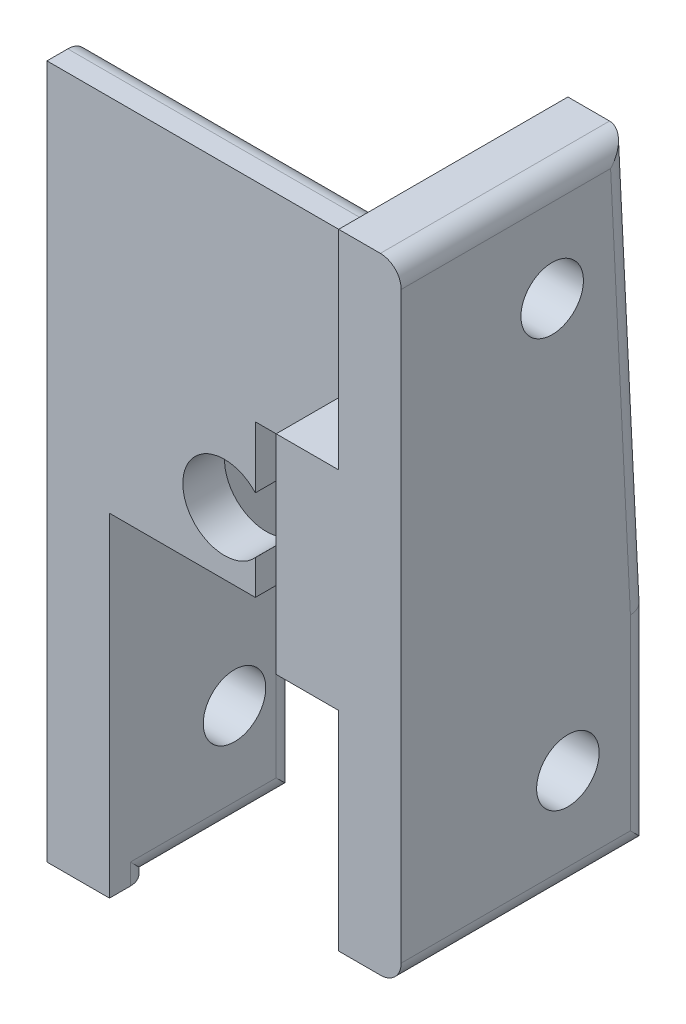
ISO-10303-21;
HEADER;
FILE_DESCRIPTION(('STEP AP214'),'2;1');
FILE_NAME('part.step','',(''),(''),'','','');
FILE_SCHEMA(('AUTOMOTIVE_DESIGN { 1 0 10303 214 1 1 1 1 }'));
ENDSEC;
DATA;
#1=APPLICATION_CONTEXT('core data for automotive mechanical design processes');
#2=APPLICATION_PROTOCOL_DEFINITION('international standard','automotive_design',2000,#1);
#3=PRODUCT_CONTEXT('',#1,'mechanical');
#4=PRODUCT('Part','Part','',(#3));
#5=PRODUCT_RELATED_PRODUCT_CATEGORY('part','',(#4));
#6=PRODUCT_DEFINITION_FORMATION('','',#4);
#7=PRODUCT_DEFINITION_CONTEXT('part definition',#1,'design');
#8=PRODUCT_DEFINITION('design','',#6,#7);
#9=PRODUCT_DEFINITION_SHAPE('','',#8);
#10=(LENGTH_UNIT() NAMED_UNIT(*) SI_UNIT(.MILLI.,.METRE.));
#11=(NAMED_UNIT(*) PLANE_ANGLE_UNIT() SI_UNIT($,.RADIAN.));
#12=(NAMED_UNIT(*) SI_UNIT($,.STERADIAN.) SOLID_ANGLE_UNIT());
#13=UNCERTAINTY_MEASURE_WITH_UNIT(LENGTH_MEASURE(1.E-05),#10,'distance_accuracy_value','');
#14=(GEOMETRIC_REPRESENTATION_CONTEXT(3) GLOBAL_UNCERTAINTY_ASSIGNED_CONTEXT((#13)) GLOBAL_UNIT_ASSIGNED_CONTEXT((#10,
#11,#12)) REPRESENTATION_CONTEXT('',''));
#15=CARTESIAN_POINT('',(0.,0.,0.));
#16=DIRECTION('',(0.,0.,1.));
#17=DIRECTION('',(1.,0.,0.));
#18=AXIS2_PLACEMENT_3D('',#15,#16,#17);
#19=CARTESIAN_POINT('',(7.,0.,0.));
#20=DIRECTION('',(1.,0.,0.));
#21=DIRECTION('',(0.,0.,-1.));
#22=AXIS2_PLACEMENT_3D('',#19,#20,#21);
#23=PLANE('',#22);
#24=DIRECTION('',(0.,0.,-1.));
#25=VECTOR('',#24,1.);
#26=CARTESIAN_POINT('',(7.,-15.645213737664,10.));
#27=LINE('',#26,#25);
#28=CARTESIAN_POINT('',(7.,-15.645213737664,2.));
#29=VERTEX_POINT('',#28);
#30=CARTESIAN_POINT('',(7.,-15.645213737664,0.));
#31=VERTEX_POINT('',#30);
#32=EDGE_CURVE('E465',#29,#31,#27,.T.);
#33=ORIENTED_EDGE('',*,*,#32,.F.);
#34=DIRECTION('',(0.,1.,0.));
#35=VECTOR('',#34,1.);
#36=CARTESIAN_POINT('',(7.,-33.3,2.));
#37=LINE('',#36,#35);
#38=CARTESIAN_POINT('',(7.,-17.3,2.));
#39=VERTEX_POINT('',#38);
#40=EDGE_CURVE('E352',#39,#29,#37,.T.);
#41=ORIENTED_EDGE('',*,*,#40,.F.);
#42=DIRECTION('',(0.,0.,-1.));
#43=VECTOR('',#42,1.);
#44=CARTESIAN_POINT('',(7.,-17.3,2.));
#45=LINE('',#44,#43);
#46=CARTESIAN_POINT('',(7.,-17.3,0.));
#47=VERTEX_POINT('',#46);
#48=EDGE_CURVE('E404',#39,#47,#45,.T.);
#49=ORIENTED_EDGE('',*,*,#48,.T.);
#50=DIRECTION('',(0.,1.,0.));
#51=VECTOR('',#50,1.);
#52=CARTESIAN_POINT('',(7.,0.,0.));
#53=LINE('',#52,#51);
#54=EDGE_CURVE('E355',#47,#31,#53,.T.);
#55=ORIENTED_EDGE('',*,*,#54,.T.);
#56=EDGE_LOOP('',(#33,#41,#49,#55));
#57=FACE_BOUND('',#56,.T.);
#58=ADVANCED_FACE('F38',(#57),#23,.T.);
#59=CARTESIAN_POINT('',(7.,0.,0.));
#60=DIRECTION('',(0.,0.,1.));
#61=DIRECTION('',(0.,-1.,0.));
#62=AXIS2_PLACEMENT_3D('',#59,#60,#61);
#63=PLANE('',#62);
#64=CARTESIAN_POINT('',(7.,-12.954786262336,0.));
#65=VERTEX_POINT('',#64);
#66=CARTESIAN_POINT('',(7.,-10.,0.));
#67=VERTEX_POINT('',#66);
#68=EDGE_CURVE('E357',#65,#67,#53,.T.);
#69=ORIENTED_EDGE('',*,*,#68,.F.);
#70=CARTESIAN_POINT('',(5.52,-14.3,0.));
#71=DIRECTION('',(0.,0.,-1.));
#72=DIRECTION('',(0.,1.,0.));
#73=AXIS2_PLACEMENT_3D('',#70,#71,#72);
#74=CIRCLE('',#73,2.);
#75=EDGE_CURVE('E468',#31,#65,#74,.T.);
#76=ORIENTED_EDGE('',*,*,#75,.F.);
#77=ORIENTED_EDGE('',*,*,#54,.F.);
#78=DIRECTION('',(1.,0.,0.));
#79=VECTOR('',#78,1.);
#80=CARTESIAN_POINT('',(7.,-17.3,0.));
#81=LINE('',#80,#79);
#82=CARTESIAN_POINT('',(0.,-17.3,0.));
#83=VERTEX_POINT('',#82);
#84=EDGE_CURVE('E377',#83,#47,#81,.T.);
#85=ORIENTED_EDGE('',*,*,#84,.F.);
#86=DIRECTION('',(0.,1.,0.));
#87=VECTOR('',#86,1.);
#88=CARTESIAN_POINT('',(0.,0.,0.));
#89=LINE('',#88,#87);
#90=CARTESIAN_POINT('',(0.,-11.,0.));
#91=VERTEX_POINT('',#90);
#92=EDGE_CURVE('E292',#83,#91,#89,.T.);
#93=ORIENTED_EDGE('',*,*,#92,.T.);
#94=CARTESIAN_POINT('',(-1.,-11.,0.));
#95=DIRECTION('',(0.,0.,1.));
#96=DIRECTION('',(0.,-1.,0.));
#97=AXIS2_PLACEMENT_3D('',#94,#95,#96);
#98=CIRCLE('',#97,1.);
#99=CARTESIAN_POINT('',(-1.,-10.,0.));
#100=VERTEX_POINT('',#99);
#101=EDGE_CURVE('E266',#91,#100,#98,.T.);
#102=ORIENTED_EDGE('',*,*,#101,.T.);
#103=DIRECTION('',(1.,0.,0.));
#104=VECTOR('',#103,1.);
#105=CARTESIAN_POINT('',(-3.,-10.,0.));
#106=LINE('',#105,#104);
#107=CARTESIAN_POINT('',(-3.,-10.,0.));
#108=VERTEX_POINT('',#107);
#109=EDGE_CURVE('E390',#108,#100,#106,.T.);
#110=ORIENTED_EDGE('',*,*,#109,.F.);
#111=DIRECTION('',(0.,-1.,0.));
#112=VECTOR('',#111,1.);
#113=CARTESIAN_POINT('',(-3.,0.,0.));
#114=LINE('',#113,#112);
#115=CARTESIAN_POINT('',(-3.,-1.,0.));
#116=VERTEX_POINT('',#115);
#117=EDGE_CURVE('E402',#116,#108,#114,.T.);
#118=ORIENTED_EDGE('',*,*,#117,.F.);
#119=DIRECTION('',(-1.,0.,0.));
#120=VECTOR('',#119,1.);
#121=CARTESIAN_POINT('',(7.,-1.,0.));
#122=LINE('',#121,#120);
#123=CARTESIAN_POINT('',(21.,-1.,0.));
#124=VERTEX_POINT('',#123);
#125=EDGE_CURVE('E481',#116,#124,#122,.F.);
#126=ORIENTED_EDGE('',*,*,#125,.T.);
#127=DIRECTION('',(0.,1.,0.));
#128=VECTOR('',#127,1.);
#129=CARTESIAN_POINT('',(21.,0.,0.));
#130=LINE('',#129,#128);
#131=CARTESIAN_POINT('',(21.,-10.,0.));
#132=VERTEX_POINT('',#131);
#133=EDGE_CURVE('E287',#132,#124,#130,.T.);
#134=ORIENTED_EDGE('',*,*,#133,.F.);
#135=DIRECTION('',(-1.,0.,0.));
#136=VECTOR('',#135,1.);
#137=CARTESIAN_POINT('',(0.,-10.,0.));
#138=LINE('',#137,#136);
#139=EDGE_CURVE('E312',#132,#67,#138,.T.);
#140=ORIENTED_EDGE('',*,*,#139,.T.);
#141=EDGE_LOOP('',(#69,#76,#77,#85,#93,#102,#110,#118,#126,#134,#140));
#142=FACE_BOUND('',#141,.T.);
#143=CARTESIAN_POINT('',(15.,-5.,0.));
#144=DIRECTION('',(0.,0.,-1.));
#145=DIRECTION('',(0.,1.,0.));
#146=AXIS2_PLACEMENT_3D('',#143,#144,#145);
#147=CIRCLE('',#146,1.5);
#148=CARTESIAN_POINT('',(15.,-3.5,0.));
#149=VERTEX_POINT('',#148);
#150=EDGE_CURVE('E298',#149,#149,#147,.T.);
#151=ORIENTED_EDGE('',*,*,#150,.F.);
#152=EDGE_LOOP('',(#151));
#153=FACE_BOUND('',#152,.T.);
#154=ADVANCED_FACE('F373',(#142,#153),#63,.F.);
#155=CARTESIAN_POINT('',(7.,0.,24.));
#156=DIRECTION('',(0.,-1.,0.));
#157=DIRECTION('',(0.,0.,-1.));
#158=AXIS2_PLACEMENT_3D('',#155,#156,#157);
#159=PLANE('',#158);
#160=DIRECTION('',(0.,0.,1.));
#161=VECTOR('',#160,1.);
#162=CARTESIAN_POINT('',(18.,0.,24.));
#163=LINE('',#162,#161);
#164=CARTESIAN_POINT('',(18.,0.,2.));
#165=VERTEX_POINT('',#164);
#166=CARTESIAN_POINT('',(18.,0.,12.));
#167=VERTEX_POINT('',#166);
#168=EDGE_CURVE('E288',#165,#167,#163,.T.);
#169=ORIENTED_EDGE('',*,*,#168,.T.);
#170=DIRECTION('',(1.,0.,0.));
#171=VECTOR('',#170,1.);
#172=CARTESIAN_POINT('',(7.,0.,12.));
#173=LINE('',#172,#171);
#174=CARTESIAN_POINT('',(21.,0.,12.));
#175=VERTEX_POINT('',#174);
#176=EDGE_CURVE('E445',#167,#175,#173,.T.);
#177=ORIENTED_EDGE('',*,*,#176,.T.);
#178=DIRECTION('',(0.,0.,1.));
#179=VECTOR('',#178,1.);
#180=CARTESIAN_POINT('',(21.,0.,24.));
#181=LINE('',#180,#179);
#182=CARTESIAN_POINT('',(21.,0.,1.));
#183=VERTEX_POINT('',#182);
#184=EDGE_CURVE('E294',#183,#175,#181,.T.);
#185=ORIENTED_EDGE('',*,*,#184,.F.);
#186=DIRECTION('',(-1.,0.,0.));
#187=VECTOR('',#186,1.);
#188=CARTESIAN_POINT('',(7.,0.,1.));
#189=LINE('',#188,#187);
#190=CARTESIAN_POINT('',(-3.,0.,1.));
#191=VERTEX_POINT('',#190);
#192=EDGE_CURVE('E299',#183,#191,#189,.T.);
#193=ORIENTED_EDGE('',*,*,#192,.T.);
#194=DIRECTION('',(0.,0.,1.));
#195=VECTOR('',#194,1.);
#196=CARTESIAN_POINT('',(-3.,0.,0.));
#197=LINE('',#196,#195);
#198=CARTESIAN_POINT('',(-3.,0.,2.));
#199=VERTEX_POINT('',#198);
#200=EDGE_CURVE('E337',#191,#199,#197,.T.);
#201=ORIENTED_EDGE('',*,*,#200,.T.);
#202=DIRECTION('',(-1.,0.,0.));
#203=VECTOR('',#202,1.);
#204=CARTESIAN_POINT('',(7.,0.,2.));
#205=LINE('',#204,#203);
#206=EDGE_CURVE('E348',#165,#199,#205,.T.);
#207=ORIENTED_EDGE('',*,*,#206,.F.);
#208=EDGE_LOOP('',(#169,#177,#185,#193,#201,#207));
#209=FACE_BOUND('',#208,.T.);
#210=ADVANCED_FACE('F505',(#209),#159,.F.);
#211=DIRECTION('',(0.,0.,-1.));
#212=VECTOR('',#211,1.);
#213=CARTESIAN_POINT('',(7.,-12.954786262336,10.));
#214=LINE('',#213,#212);
#215=CARTESIAN_POINT('',(7.,-12.954786262336,2.));
#216=VERTEX_POINT('',#215);
#217=EDGE_CURVE('E53',#65,#216,#214,.F.);
#218=ORIENTED_EDGE('',*,*,#217,.F.);
#219=ORIENTED_EDGE('',*,*,#68,.T.);
#220=DIRECTION('',(0.,0.,-1.));
#221=VECTOR('',#220,1.);
#222=CARTESIAN_POINT('',(7.,-10.,0.));
#223=LINE('',#222,#221);
#224=CARTESIAN_POINT('',(7.,-10.,2.));
#225=VERTEX_POINT('',#224);
#226=EDGE_CURVE('E321',#225,#67,#223,.T.);
#227=ORIENTED_EDGE('',*,*,#226,.F.);
#228=EDGE_CURVE('E351',#216,#225,#37,.T.);
#229=ORIENTED_EDGE('',*,*,#228,.F.);
#230=EDGE_LOOP('',(#218,#219,#227,#229));
#231=FACE_BOUND('',#230,.T.);
#232=ADVANCED_FACE('F563',(#231),#23,.T.);
#233=CARTESIAN_POINT('',(7.,-33.3,2.));
#234=DIRECTION('',(0.,0.,-1.));
#235=DIRECTION('',(-1.,0.,0.));
#236=AXIS2_PLACEMENT_3D('',#233,#234,#235);
#237=PLANE('',#236);
#238=DIRECTION('',(0.,1.,0.));
#239=VECTOR('',#238,1.);
#240=CARTESIAN_POINT('',(-3.,0.,2.));
#241=LINE('',#240,#239);
#242=CARTESIAN_POINT('',(-3.,-33.3,2.));
#243=VERTEX_POINT('',#242);
#244=EDGE_CURVE('E395',#243,#199,#241,.T.);
#245=ORIENTED_EDGE('',*,*,#244,.F.);
#246=DIRECTION('',(1.,0.,0.));
#247=VECTOR('',#246,1.);
#248=CARTESIAN_POINT('',(7.,-33.3,2.));
#249=LINE('',#248,#247);
#250=CARTESIAN_POINT('',(0.,-33.3,2.));
#251=VERTEX_POINT('',#250);
#252=EDGE_CURVE('E219',#243,#251,#249,.T.);
#253=ORIENTED_EDGE('',*,*,#252,.T.);
#254=DIRECTION('',(0.,-1.,0.));
#255=VECTOR('',#254,1.);
#256=CARTESIAN_POINT('',(0.,0.,2.));
#257=LINE('',#256,#255);
#258=CARTESIAN_POINT('',(0.,-17.3,2.));
#259=VERTEX_POINT('',#258);
#260=EDGE_CURVE('E227',#259,#251,#257,.T.);
#261=ORIENTED_EDGE('',*,*,#260,.F.);
#262=DIRECTION('',(1.,0.,0.));
#263=VECTOR('',#262,1.);
#264=CARTESIAN_POINT('',(7.,-17.3,2.));
#265=LINE('',#264,#263);
#266=EDGE_CURVE('E407',#259,#39,#265,.T.);
#267=ORIENTED_EDGE('',*,*,#266,.T.);
#268=ORIENTED_EDGE('',*,*,#40,.T.);
#269=CARTESIAN_POINT('',(5.52,-14.3,2.));
#270=DIRECTION('',(0.,0.,-1.));
#271=DIRECTION('',(-1.,0.,0.));
#272=AXIS2_PLACEMENT_3D('',#269,#270,#271);
#273=CIRCLE('',#272,2.);
#274=EDGE_CURVE('E11',#29,#216,#273,.T.);
#275=ORIENTED_EDGE('',*,*,#274,.T.);
#276=ORIENTED_EDGE('',*,*,#228,.T.);
#277=DIRECTION('',(-1.,0.,0.));
#278=VECTOR('',#277,1.);
#279=CARTESIAN_POINT('',(0.,-10.,2.));
#280=LINE('',#279,#278);
#281=CARTESIAN_POINT('',(18.,-10.,2.));
#282=VERTEX_POINT('',#281);
#283=EDGE_CURVE('E318',#282,#225,#280,.T.);
#284=ORIENTED_EDGE('',*,*,#283,.F.);
#285=DIRECTION('',(0.,-1.,0.));
#286=VECTOR('',#285,1.);
#287=CARTESIAN_POINT('',(18.,0.,2.));
#288=LINE('',#287,#286);
#289=EDGE_CURVE('E315',#165,#282,#288,.T.);
#290=ORIENTED_EDGE('',*,*,#289,.F.);
#291=ORIENTED_EDGE('',*,*,#206,.T.);
#292=EDGE_LOOP('',(#245,#253,#261,#267,#268,#275,#276,#284,#290,#291));
#293=FACE_BOUND('',#292,.T.);
#294=CARTESIAN_POINT('',(15.,-5.,2.));
#295=DIRECTION('',(0.,0.,-1.));
#296=DIRECTION('',(0.,1.,0.));
#297=AXIS2_PLACEMENT_3D('',#294,#295,#296);
#298=CIRCLE('',#297,1.5);
#299=CARTESIAN_POINT('',(15.,-3.5,2.));
#300=VERTEX_POINT('',#299);
#301=EDGE_CURVE('E309',#300,#300,#298,.T.);
#302=ORIENTED_EDGE('',*,*,#301,.T.);
#303=EDGE_LOOP('',(#302));
#304=FACE_BOUND('',#303,.T.);
#305=ADVANCED_FACE('F472',(#293,#304),#237,.F.);
#306=CARTESIAN_POINT('',(0.,-10.,21.));
#307=DIRECTION('',(0.,-1.,0.));
#308=DIRECTION('',(0.,0.,-1.));
#309=AXIS2_PLACEMENT_3D('',#306,#307,#308);
#310=PLANE('',#309);
#311=DIRECTION('',(1.,0.,0.));
#312=VECTOR('',#311,1.);
#313=CARTESIAN_POINT('',(0.,-10.,12.));
#314=LINE('',#313,#312);
#315=CARTESIAN_POINT('',(18.,-10.,12.));
#316=VERTEX_POINT('',#315);
#317=CARTESIAN_POINT('',(21.,-10.,12.));
#318=VERTEX_POINT('',#317);
#319=EDGE_CURVE('E451',#316,#318,#314,.T.);
#320=ORIENTED_EDGE('',*,*,#319,.F.);
#321=DIRECTION('',(0.,0.,-1.));
#322=VECTOR('',#321,1.);
#323=CARTESIAN_POINT('',(18.,-10.,24.));
#324=LINE('',#323,#322);
#325=EDGE_CURVE('E305',#316,#282,#324,.T.);
#326=ORIENTED_EDGE('',*,*,#325,.T.);
#327=ORIENTED_EDGE('',*,*,#283,.T.);
#328=ORIENTED_EDGE('',*,*,#226,.T.);
#329=ORIENTED_EDGE('',*,*,#139,.F.);
#330=DIRECTION('',(0.,0.,-1.));
#331=VECTOR('',#330,1.);
#332=CARTESIAN_POINT('',(21.,-10.,24.));
#333=LINE('',#332,#331);
#334=EDGE_CURVE('E285',#318,#132,#333,.T.);
#335=ORIENTED_EDGE('',*,*,#334,.F.);
#336=EDGE_LOOP('',(#320,#326,#327,#328,#329,#335));
#337=FACE_BOUND('',#336,.T.);
#338=ADVANCED_FACE('F515',(#337),#310,.T.);
#339=CARTESIAN_POINT('',(0.,0.,0.));
#340=DIRECTION('',(-1.,0.,0.));
#341=DIRECTION('',(0.,0.,1.));
#342=AXIS2_PLACEMENT_3D('',#339,#340,#341);
#343=PLANE('',#342);
#344=ORIENTED_EDGE('',*,*,#260,.T.);
#345=DIRECTION('',(0.,0.,1.));
#346=VECTOR('',#345,1.);
#347=CARTESIAN_POINT('',(0.,-33.3,0.));
#348=LINE('',#347,#346);
#349=CARTESIAN_POINT('',(0.,-33.3,0.999999999999999));
#350=VERTEX_POINT('',#349);
#351=EDGE_CURVE('E211',#350,#251,#348,.T.);
#352=ORIENTED_EDGE('',*,*,#351,.F.);
#353=DIRECTION('',(0.,-1.,0.));
#354=VECTOR('',#353,1.);
#355=CARTESIAN_POINT('',(0.,0.,0.999999999999979));
#356=LINE('',#355,#354);
#357=CARTESIAN_POINT('',(0.,-32.3,0.999999999999995));
#358=VERTEX_POINT('',#357);
#359=EDGE_CURVE('E225',#350,#358,#356,.F.);
#360=ORIENTED_EDGE('',*,*,#359,.T.);
#361=DIRECTION('',(0.,0.,-1.));
#362=VECTOR('',#361,1.);
#363=CARTESIAN_POINT('',(0.,-32.3,-7.));
#364=LINE('',#363,#362);
#365=CARTESIAN_POINT('',(0.,-32.3,-6.));
#366=VERTEX_POINT('',#365);
#367=EDGE_CURVE('E232',#358,#366,#364,.T.);
#368=ORIENTED_EDGE('',*,*,#367,.T.);
#369=DIRECTION('',(0.,-1.,0.));
#370=VECTOR('',#369,1.);
#371=CARTESIAN_POINT('',(0.,0.,-6.));
#372=LINE('',#371,#370);
#373=CARTESIAN_POINT('',(0.,-11.,-6.));
#374=VERTEX_POINT('',#373);
#375=EDGE_CURVE('E235',#366,#374,#372,.F.);
#376=ORIENTED_EDGE('',*,*,#375,.T.);
#377=DIRECTION('',(0.,0.,-1.));
#378=VECTOR('',#377,1.);
#379=CARTESIAN_POINT('',(0.,-11.,0.));
#380=LINE('',#379,#378);
#381=EDGE_CURVE('E243',#374,#91,#380,.F.);
#382=ORIENTED_EDGE('',*,*,#381,.T.);
#383=ORIENTED_EDGE('',*,*,#92,.F.);
#384=DIRECTION('',(0.,0.,-1.));
#385=VECTOR('',#384,1.);
#386=CARTESIAN_POINT('',(0.,-17.3,2.));
#387=LINE('',#386,#385);
#388=EDGE_CURVE('E405',#259,#83,#387,.T.);
#389=ORIENTED_EDGE('',*,*,#388,.F.);
#390=EDGE_LOOP('',(#344,#352,#360,#368,#376,#382,#383,#389));
#391=FACE_BOUND('',#390,.T.);
#392=CARTESIAN_POINT('',(0.,-28.3,-4.));
#393=DIRECTION('',(-1.,0.,0.));
#394=DIRECTION('',(0.,0.,1.));
#395=AXIS2_PLACEMENT_3D('',#392,#393,#394);
#396=CIRCLE('',#395,1.5);
#397=CARTESIAN_POINT('',(0.,-28.3,-2.5));
#398=VERTEX_POINT('',#397);
#399=EDGE_CURVE('E326',#398,#398,#396,.T.);
#400=ORIENTED_EDGE('',*,*,#399,.T.);
#401=EDGE_LOOP('',(#400));
#402=FACE_BOUND('',#401,.T.);
#403=CARTESIAN_POINT('',(0.,-15.,-4.));
#404=DIRECTION('',(-1.,0.,0.));
#405=DIRECTION('',(0.,0.,1.));
#406=AXIS2_PLACEMENT_3D('',#403,#404,#405);
#407=CIRCLE('',#406,1.5);
#408=CARTESIAN_POINT('',(0.,-15.,-2.5));
#409=VERTEX_POINT('',#408);
#410=EDGE_CURVE('E331',#409,#409,#407,.T.);
#411=ORIENTED_EDGE('',*,*,#410,.T.);
#412=EDGE_LOOP('',(#411));
#413=FACE_BOUND('',#412,.T.);
#414=ADVANCED_FACE('F223',(#391,#402,#413),#343,.F.);
#415=CARTESIAN_POINT('',(-3.,-33.3,0.));
#416=DIRECTION('',(0.,-1.,0.));
#417=DIRECTION('',(0.,0.,-1.));
#418=AXIS2_PLACEMENT_3D('',#415,#416,#417);
#419=PLANE('',#418);
#420=DIRECTION('',(1.,0.,0.));
#421=VECTOR('',#420,1.);
#422=CARTESIAN_POINT('',(-3.,-33.3,-7.));
#423=LINE('',#422,#421);
#424=CARTESIAN_POINT('',(-3.,-33.3,-7.));
#425=VERTEX_POINT('',#424);
#426=CARTESIAN_POINT('',(-1.,-33.3,-7.));
#427=VERTEX_POINT('',#426);
#428=EDGE_CURVE('E342',#425,#427,#423,.T.);
#429=ORIENTED_EDGE('',*,*,#428,.T.);
#430=DIRECTION('',(0.,0.,-1.));
#431=VECTOR('',#430,1.);
#432=CARTESIAN_POINT('',(-1.,-33.3,0.));
#433=LINE('',#432,#431);
#434=CARTESIAN_POINT('',(-1.,-33.3,0.));
#435=VERTEX_POINT('',#434);
#436=EDGE_CURVE('E214',#427,#435,#433,.F.);
#437=ORIENTED_EDGE('',*,*,#436,.T.);
#438=CARTESIAN_POINT('',(-1.,-33.3,0.999999999999996));
#439=DIRECTION('',(0.,1.,0.));
#440=DIRECTION('',(0.,0.,1.));
#441=AXIS2_PLACEMENT_3D('',#438,#439,#440);
#442=CIRCLE('',#441,1.);
#443=EDGE_CURVE('E206',#435,#350,#442,.F.);
#444=ORIENTED_EDGE('',*,*,#443,.T.);
#445=ORIENTED_EDGE('',*,*,#351,.T.);
#446=ORIENTED_EDGE('',*,*,#252,.F.);
#447=DIRECTION('',(0.,0.,-1.));
#448=VECTOR('',#447,1.);
#449=CARTESIAN_POINT('',(-3.,-33.3,0.));
#450=LINE('',#449,#448);
#451=EDGE_CURVE('E334',#243,#425,#450,.T.);
#452=ORIENTED_EDGE('',*,*,#451,.T.);
#453=EDGE_LOOP('',(#429,#437,#444,#445,#446,#452));
#454=FACE_BOUND('',#453,.T.);
#455=ADVANCED_FACE('F209',(#454),#419,.T.);
#456=CARTESIAN_POINT('',(-3.,0.,-7.));
#457=DIRECTION('',(0.,0.,1.));
#458=DIRECTION('',(0.,-1.,0.));
#459=AXIS2_PLACEMENT_3D('',#456,#457,#458);
#460=PLANE('',#459);
#461=DIRECTION('',(1.,0.,0.));
#462=VECTOR('',#461,1.);
#463=CARTESIAN_POINT('',(-3.,-10.,-7.));
#464=LINE('',#463,#462);
#465=CARTESIAN_POINT('',(-3.,-10.,-7.));
#466=VERTEX_POINT('',#465);
#467=CARTESIAN_POINT('',(-1.,-10.,-7.));
#468=VERTEX_POINT('',#467);
#469=EDGE_CURVE('E388',#466,#468,#464,.T.);
#470=ORIENTED_EDGE('',*,*,#469,.T.);
#471=DIRECTION('',(0.,-1.,0.));
#472=VECTOR('',#471,1.);
#473=CARTESIAN_POINT('',(-1.,0.,-7.));
#474=LINE('',#473,#472);
#475=EDGE_CURVE('E233',#468,#427,#474,.T.);
#476=ORIENTED_EDGE('',*,*,#475,.T.);
#477=ORIENTED_EDGE('',*,*,#428,.F.);
#478=DIRECTION('',(0.,-1.,0.));
#479=VECTOR('',#478,1.);
#480=CARTESIAN_POINT('',(-3.,0.,-7.));
#481=LINE('',#480,#479);
#482=EDGE_CURVE('E340',#466,#425,#481,.T.);
#483=ORIENTED_EDGE('',*,*,#482,.F.);
#484=EDGE_LOOP('',(#470,#476,#477,#483));
#485=FACE_BOUND('',#484,.T.);
#486=ADVANCED_FACE('F393',(#485),#460,.F.);
#487=CARTESIAN_POINT('',(-3.,-15.,-4.));
#488=DIRECTION('',(1.,0.,0.));
#489=DIRECTION('',(0.,0.,-1.));
#490=AXIS2_PLACEMENT_3D('',#487,#488,#489);
#491=CYLINDRICAL_SURFACE('',#490,1.5);
#492=CARTESIAN_POINT('',(-3.,-15.,-4.));
#493=DIRECTION('',(-1.,0.,0.));
#494=DIRECTION('',(0.,0.,1.));
#495=AXIS2_PLACEMENT_3D('',#492,#493,#494);
#496=CIRCLE('',#495,1.5);
#497=CARTESIAN_POINT('',(-3.,-15.,-2.5));
#498=VERTEX_POINT('',#497);
#499=EDGE_CURVE('E330',#498,#498,#496,.T.);
#500=ORIENTED_EDGE('',*,*,#499,.T.);
#501=EDGE_LOOP('',(#500));
#502=FACE_BOUND('',#501,.T.);
#503=ORIENTED_EDGE('',*,*,#410,.F.);
#504=EDGE_LOOP('',(#503));
#505=FACE_BOUND('',#504,.T.);
#506=ADVANCED_FACE('F608',(#502,#505),#491,.F.);
#507=CARTESIAN_POINT('',(-3.,-28.3,-4.));
#508=DIRECTION('',(1.,0.,0.));
#509=DIRECTION('',(0.,0.,-1.));
#510=AXIS2_PLACEMENT_3D('',#507,#508,#509);
#511=CYLINDRICAL_SURFACE('',#510,1.5);
#512=CARTESIAN_POINT('',(-3.,-28.3,-4.));
#513=DIRECTION('',(-1.,0.,0.));
#514=DIRECTION('',(0.,0.,1.));
#515=AXIS2_PLACEMENT_3D('',#512,#513,#514);
#516=CIRCLE('',#515,1.5);
#517=CARTESIAN_POINT('',(-3.,-28.3,-2.5));
#518=VERTEX_POINT('',#517);
#519=EDGE_CURVE('E327',#518,#518,#516,.T.);
#520=ORIENTED_EDGE('',*,*,#519,.T.);
#521=EDGE_LOOP('',(#520));
#522=FACE_BOUND('',#521,.T.);
#523=ORIENTED_EDGE('',*,*,#399,.F.);
#524=EDGE_LOOP('',(#523));
#525=FACE_BOUND('',#524,.T.);
#526=ADVANCED_FACE('F603',(#522,#525),#511,.F.);
#527=CARTESIAN_POINT('',(-3.,0.,0.));
#528=DIRECTION('',(-1.,0.,0.));
#529=DIRECTION('',(0.,0.,1.));
#530=AXIS2_PLACEMENT_3D('',#527,#528,#529);
#531=PLANE('',#530);
#532=ORIENTED_EDGE('',*,*,#451,.F.);
#533=ORIENTED_EDGE('',*,*,#244,.T.);
#534=ORIENTED_EDGE('',*,*,#200,.F.);
#535=CARTESIAN_POINT('',(-3.,-1.,1.));
#536=DIRECTION('',(-1.,0.,0.));
#537=DIRECTION('',(0.,0.,1.));
#538=AXIS2_PLACEMENT_3D('',#535,#536,#537);
#539=CIRCLE('',#538,1.);
#540=EDGE_CURVE('E364',#191,#116,#539,.T.);
#541=ORIENTED_EDGE('',*,*,#540,.T.);
#542=ORIENTED_EDGE('',*,*,#117,.T.);
#543=DIRECTION('',(0.,0.,-1.));
#544=VECTOR('',#543,1.);
#545=CARTESIAN_POINT('',(-3.,-10.,0.));
#546=LINE('',#545,#544);
#547=EDGE_CURVE('E398',#108,#466,#546,.T.);
#548=ORIENTED_EDGE('',*,*,#547,.T.);
#549=ORIENTED_EDGE('',*,*,#482,.T.);
#550=EDGE_LOOP('',(#532,#533,#534,#541,#542,#548,#549));
#551=FACE_BOUND('',#550,.T.);
#552=ORIENTED_EDGE('',*,*,#519,.F.);
#553=EDGE_LOOP('',(#552));
#554=FACE_BOUND('',#553,.T.);
#555=ORIENTED_EDGE('',*,*,#499,.F.);
#556=EDGE_LOOP('',(#555));
#557=FACE_BOUND('',#556,.T.);
#558=ADVANCED_FACE('F475',(#551,#554,#557),#531,.T.);
#559=CARTESIAN_POINT('',(15.,-5.,2.));
#560=DIRECTION('',(0.,0.,-1.));
#561=DIRECTION('',(0.,1.,0.));
#562=AXIS2_PLACEMENT_3D('',#559,#560,#561);
#563=CYLINDRICAL_SURFACE('',#562,1.5);
#564=ORIENTED_EDGE('',*,*,#301,.F.);
#565=EDGE_LOOP('',(#564));
#566=FACE_BOUND('',#565,.T.);
#567=ORIENTED_EDGE('',*,*,#150,.T.);
#568=EDGE_LOOP('',(#567));
#569=FACE_BOUND('',#568,.T.);
#570=ADVANCED_FACE('F597',(#566,#569),#563,.F.);
#571=CARTESIAN_POINT('',(18.,0.,0.));
#572=DIRECTION('',(1.,0.,0.));
#573=DIRECTION('',(0.,0.,-1.));
#574=AXIS2_PLACEMENT_3D('',#571,#572,#573);
#575=PLANE('',#574);
#576=ORIENTED_EDGE('',*,*,#325,.F.);
#577=DIRECTION('',(0.,1.,0.));
#578=VECTOR('',#577,1.);
#579=CARTESIAN_POINT('',(18.,0.,12.));
#580=LINE('',#579,#578);
#581=EDGE_CURVE('E448',#316,#167,#580,.T.);
#582=ORIENTED_EDGE('',*,*,#581,.T.);
#583=ORIENTED_EDGE('',*,*,#168,.F.);
#584=ORIENTED_EDGE('',*,*,#289,.T.);
#585=EDGE_LOOP('',(#576,#582,#583,#584));
#586=FACE_BOUND('',#585,.T.);
#587=ADVANCED_FACE('F511',(#586),#575,.F.);
#588=CARTESIAN_POINT('',(21.,0.,0.));
#589=DIRECTION('',(1.,0.,0.));
#590=DIRECTION('',(0.,0.,-1.));
#591=AXIS2_PLACEMENT_3D('',#588,#589,#590);
#592=PLANE('',#591);
#593=ORIENTED_EDGE('',*,*,#133,.T.);
#594=CARTESIAN_POINT('',(21.,-1.,1.));
#595=DIRECTION('',(1.,0.,0.));
#596=DIRECTION('',(0.,0.,-1.));
#597=AXIS2_PLACEMENT_3D('',#594,#595,#596);
#598=CIRCLE('',#597,1.);
#599=CARTESIAN_POINT('',(21.,-0.137994986000923,0.493100250699954));
#600=VERTEX_POINT('',#599);
#601=EDGE_CURVE('E238',#124,#600,#598,.T.);
#602=ORIENTED_EDGE('',*,*,#601,.T.);
#603=DIRECTION('',(0.,0.998752338877845,0.0499376169438926));
#604=VECTOR('',#603,1.);
#605=CARTESIAN_POINT('',(21.,-0.0249376558603493,0.498753117206983));
#606=LINE('',#605,#604);
#607=EDGE_CURVE('E428',#132,#600,#606,.T.);
#608=ORIENTED_EDGE('',*,*,#607,.F.);
#609=EDGE_LOOP('',(#593,#602,#608));
#610=FACE_BOUND('',#609,.T.);
#611=ADVANCED_FACE('F494',(#610),#592,.T.);
#612=CARTESIAN_POINT('',(-3.,-10.,0.));
#613=DIRECTION('',(0.,-1.,0.));
#614=DIRECTION('',(0.,0.,-1.));
#615=AXIS2_PLACEMENT_3D('',#612,#613,#614);
#616=PLANE('',#615);
#617=ORIENTED_EDGE('',*,*,#109,.T.);
#618=DIRECTION('',(0.,0.,-1.));
#619=VECTOR('',#618,1.);
#620=CARTESIAN_POINT('',(-1.,-10.,0.));
#621=LINE('',#620,#619);
#622=EDGE_CURVE('E245',#100,#468,#621,.T.);
#623=ORIENTED_EDGE('',*,*,#622,.T.);
#624=ORIENTED_EDGE('',*,*,#469,.F.);
#625=ORIENTED_EDGE('',*,*,#547,.F.);
#626=EDGE_LOOP('',(#617,#623,#624,#625));
#627=FACE_BOUND('',#626,.T.);
#628=ADVANCED_FACE('F386',(#627),#616,.F.);
#629=CARTESIAN_POINT('',(7.,-17.3,2.));
#630=DIRECTION('',(0.,1.,0.));
#631=DIRECTION('',(0.,0.,1.));
#632=AXIS2_PLACEMENT_3D('',#629,#630,#631);
#633=PLANE('',#632);
#634=ORIENTED_EDGE('',*,*,#84,.T.);
#635=ORIENTED_EDGE('',*,*,#48,.F.);
#636=ORIENTED_EDGE('',*,*,#266,.F.);
#637=ORIENTED_EDGE('',*,*,#388,.T.);
#638=EDGE_LOOP('',(#634,#635,#636,#637));
#639=FACE_BOUND('',#638,.T.);
#640=ADVANCED_FACE('F581',(#639),#633,.F.);
#641=CARTESIAN_POINT('',(21.,0.,0.));
#642=DIRECTION('',(1.,0.,0.));
#643=DIRECTION('',(0.,0.,-1.));
#644=AXIS2_PLACEMENT_3D('',#641,#642,#643);
#645=PLANE('',#644);
#646=CARTESIAN_POINT('',(21.,-15.,4.));
#647=DIRECTION('',(1.,0.,0.));
#648=DIRECTION('',(0.,0.,-1.));
#649=AXIS2_PLACEMENT_3D('',#646,#647,#648);
#650=CIRCLE('',#649,1.5);
#651=CARTESIAN_POINT('',(21.,-15.,2.5));
#652=VERTEX_POINT('',#651);
#653=EDGE_CURVE('E422',#652,#652,#650,.T.);
#654=ORIENTED_EDGE('',*,*,#653,.T.);
#655=EDGE_LOOP('',(#654));
#656=FACE_BOUND('',#655,.T.);
#657=DIRECTION('',(0.,0.,-1.));
#658=VECTOR('',#657,1.);
#659=CARTESIAN_POINT('',(21.,-20.,0.));
#660=LINE('',#659,#658);
#661=CARTESIAN_POINT('',(21.,-20.,12.));
#662=VERTEX_POINT('',#661);
#663=CARTESIAN_POINT('',(21.,-20.,0.));
#664=VERTEX_POINT('',#663);
#665=EDGE_CURVE('E435',#662,#664,#660,.T.);
#666=ORIENTED_EDGE('',*,*,#665,.F.);
#667=DIRECTION('',(0.,1.,0.));
#668=VECTOR('',#667,1.);
#669=CARTESIAN_POINT('',(21.,0.,12.));
#670=LINE('',#669,#668);
#671=EDGE_CURVE('E453',#662,#318,#670,.T.);
#672=ORIENTED_EDGE('',*,*,#671,.T.);
#673=ORIENTED_EDGE('',*,*,#334,.T.);
#674=DIRECTION('',(0.,-1.,0.));
#675=VECTOR('',#674,1.);
#676=CARTESIAN_POINT('',(21.,0.,0.));
#677=LINE('',#676,#675);
#678=EDGE_CURVE('E432',#132,#664,#677,.T.);
#679=ORIENTED_EDGE('',*,*,#678,.T.);
#680=EDGE_LOOP('',(#666,#672,#673,#679));
#681=FACE_BOUND('',#680,.T.);
#682=ADVANCED_FACE('F519',(#656,#681),#645,.F.);
#683=CARTESIAN_POINT('',(21.,5.,4.75499687890016));
#684=DIRECTION('',(1.,0.,0.));
#685=DIRECTION('',(0.,0.,-1.));
#686=AXIS2_PLACEMENT_3D('',#683,#684,#685);
#687=CIRCLE('',#686,1.5);
#688=CARTESIAN_POINT('',(21.,5.,3.25499687890016));
#689=VERTEX_POINT('',#688);
#690=EDGE_CURVE('E275',#689,#689,#687,.T.);
#691=ORIENTED_EDGE('',*,*,#690,.T.);
#692=EDGE_LOOP('',(#691));
#693=FACE_BOUND('',#692,.T.);
#694=ORIENTED_EDGE('',*,*,#184,.T.);
#695=DIRECTION('',(0.,1.,0.));
#696=VECTOR('',#695,1.);
#697=CARTESIAN_POINT('',(21.,0.,12.));
#698=LINE('',#697,#696);
#699=CARTESIAN_POINT('',(21.,10.,12.));
#700=VERTEX_POINT('',#699);
#701=EDGE_CURVE('E280',#175,#700,#698,.T.);
#702=ORIENTED_EDGE('',*,*,#701,.T.);
#703=DIRECTION('',(0.,0.,-1.));
#704=VECTOR('',#703,1.);
#705=CARTESIAN_POINT('',(21.,10.,0.));
#706=LINE('',#705,#704);
#707=CARTESIAN_POINT('',(21.,10.,1.));
#708=VERTEX_POINT('',#707);
#709=EDGE_CURVE('E426',#700,#708,#706,.T.);
#710=ORIENTED_EDGE('',*,*,#709,.T.);
#711=EDGE_CURVE('E431',#600,#708,#606,.T.);
#712=ORIENTED_EDGE('',*,*,#711,.F.);
#713=CARTESIAN_POINT('',(21.,-1.,1.));
#714=DIRECTION('',(1.,0.,0.));
#715=DIRECTION('',(0.,0.,-1.));
#716=AXIS2_PLACEMENT_3D('',#713,#714,#715);
#717=CIRCLE('',#716,1.);
#718=EDGE_CURVE('E264',#600,#183,#717,.T.);
#719=ORIENTED_EDGE('',*,*,#718,.T.);
#720=EDGE_LOOP('',(#694,#702,#710,#712,#719));
#721=FACE_BOUND('',#720,.T.);
#722=ADVANCED_FACE('F503',(#693,#721),#645,.F.);
#723=CARTESIAN_POINT('',(24.,-20.,0.));
#724=DIRECTION('',(0.,1.,0.));
#725=DIRECTION('',(0.,0.,1.));
#726=AXIS2_PLACEMENT_3D('',#723,#724,#725);
#727=PLANE('',#726);
#728=DIRECTION('',(0.,0.,-1.));
#729=VECTOR('',#728,1.);
#730=CARTESIAN_POINT('',(23.,-20.,24.));
#731=LINE('',#730,#729);
#732=CARTESIAN_POINT('',(23.,-20.,0.));
#733=VERTEX_POINT('',#732);
#734=CARTESIAN_POINT('',(23.,-20.,12.));
#735=VERTEX_POINT('',#734);
#736=EDGE_CURVE('E261',#733,#735,#731,.F.);
#737=ORIENTED_EDGE('',*,*,#736,.T.);
#738=DIRECTION('',(-1.,0.,0.));
#739=VECTOR('',#738,1.);
#740=CARTESIAN_POINT('',(24.,-20.,12.));
#741=LINE('',#740,#739);
#742=EDGE_CURVE('E456',#735,#662,#741,.T.);
#743=ORIENTED_EDGE('',*,*,#742,.T.);
#744=ORIENTED_EDGE('',*,*,#665,.T.);
#745=DIRECTION('',(-1.,0.,0.));
#746=VECTOR('',#745,1.);
#747=CARTESIAN_POINT('',(24.,-20.,0.));
#748=LINE('',#747,#746);
#749=EDGE_CURVE('E410',#733,#664,#748,.T.);
#750=ORIENTED_EDGE('',*,*,#749,.F.);
#751=EDGE_LOOP('',(#737,#743,#744,#750));
#752=FACE_BOUND('',#751,.T.);
#753=ADVANCED_FACE('F523',(#752),#727,.F.);
#754=CARTESIAN_POINT('',(24.,0.,0.));
#755=DIRECTION('',(0.,0.,-1.));
#756=DIRECTION('',(0.,1.,0.));
#757=AXIS2_PLACEMENT_3D('',#754,#755,#756);
#758=PLANE('',#757);
#759=DIRECTION('',(-1.,0.,0.));
#760=VECTOR('',#759,1.);
#761=CARTESIAN_POINT('',(24.,-10.,0.));
#762=LINE('',#761,#760);
#763=CARTESIAN_POINT('',(23.,-10.,0.));
#764=VERTEX_POINT('',#763);
#765=EDGE_CURVE('E415',#764,#132,#762,.T.);
#766=ORIENTED_EDGE('',*,*,#765,.F.);
#767=DIRECTION('',(0.,-1.,0.));
#768=VECTOR('',#767,1.);
#769=CARTESIAN_POINT('',(23.,0.,0.));
#770=LINE('',#769,#768);
#771=EDGE_CURVE('E259',#764,#733,#770,.T.);
#772=ORIENTED_EDGE('',*,*,#771,.T.);
#773=ORIENTED_EDGE('',*,*,#749,.T.);
#774=ORIENTED_EDGE('',*,*,#678,.F.);
#775=EDGE_LOOP('',(#766,#772,#773,#774));
#776=FACE_BOUND('',#775,.T.);
#777=ADVANCED_FACE('F526',(#776),#758,.T.);
#778=CARTESIAN_POINT('',(24.,-0.0249376558603493,0.498753117206983));
#779=DIRECTION('',(0.,-0.0499376169438926,0.998752338877845));
#780=DIRECTION('',(0.,-0.998752338877845,-0.0499376169438926));
#781=AXIS2_PLACEMENT_3D('',#778,#779,#780);
#782=PLANE('',#781);
#783=DIRECTION('',(-1.,0.,0.));
#784=VECTOR('',#783,1.);
#785=CARTESIAN_POINT('',(24.,10.,1.));
#786=LINE('',#785,#784);
#787=CARTESIAN_POINT('',(23.,10.,1.));
#788=VERTEX_POINT('',#787);
#789=EDGE_CURVE('E418',#788,#708,#786,.T.);
#790=ORIENTED_EDGE('',*,*,#789,.F.);
#791=DIRECTION('',(0.,0.998752338877845,0.0499376169438926));
#792=VECTOR('',#791,1.);
#793=CARTESIAN_POINT('',(23.,-0.0249376558603493,0.498753117206983));
#794=LINE('',#793,#792);
#795=EDGE_CURVE('E489',#788,#764,#794,.F.);
#796=ORIENTED_EDGE('',*,*,#795,.T.);
#797=ORIENTED_EDGE('',*,*,#765,.T.);
#798=ORIENTED_EDGE('',*,*,#607,.T.);
#799=ORIENTED_EDGE('',*,*,#711,.T.);
#800=EDGE_LOOP('',(#790,#796,#797,#798,#799));
#801=FACE_BOUND('',#800,.T.);
#802=ADVANCED_FACE('F499',(#801),#782,.F.);
#803=CARTESIAN_POINT('',(24.,-15.,4.));
#804=DIRECTION('',(-1.,0.,0.));
#805=DIRECTION('',(0.,0.,1.));
#806=AXIS2_PLACEMENT_3D('',#803,#804,#805);
#807=CYLINDRICAL_SURFACE('',#806,1.5);
#808=CARTESIAN_POINT('',(24.,-15.,4.));
#809=DIRECTION('',(1.,0.,0.));
#810=DIRECTION('',(0.,0.,-1.));
#811=AXIS2_PLACEMENT_3D('',#808,#809,#810);
#812=CIRCLE('',#811,1.5);
#813=CARTESIAN_POINT('',(24.,-15.,2.5));
#814=VERTEX_POINT('',#813);
#815=EDGE_CURVE('E421',#814,#814,#812,.T.);
#816=ORIENTED_EDGE('',*,*,#815,.T.);
#817=EDGE_LOOP('',(#816));
#818=FACE_BOUND('',#817,.T.);
#819=ORIENTED_EDGE('',*,*,#653,.F.);
#820=EDGE_LOOP('',(#819));
#821=FACE_BOUND('',#820,.T.);
#822=ADVANCED_FACE('F550',(#818,#821),#807,.F.);
#823=CARTESIAN_POINT('',(24.,10.,0.));
#824=DIRECTION('',(0.,1.,0.));
#825=DIRECTION('',(0.,0.,1.));
#826=AXIS2_PLACEMENT_3D('',#823,#824,#825);
#827=PLANE('',#826);
#828=DIRECTION('',(1.,0.,0.));
#829=VECTOR('',#828,1.);
#830=CARTESIAN_POINT('',(-3.,10.,12.));
#831=LINE('',#830,#829);
#832=CARTESIAN_POINT('',(23.,10.,12.));
#833=VERTEX_POINT('',#832);
#834=EDGE_CURVE('E462',#700,#833,#831,.T.);
#835=ORIENTED_EDGE('',*,*,#834,.T.);
#836=DIRECTION('',(0.,0.,-1.));
#837=VECTOR('',#836,1.);
#838=CARTESIAN_POINT('',(23.,10.,0.));
#839=LINE('',#838,#837);
#840=EDGE_CURVE('E248',#833,#788,#839,.T.);
#841=ORIENTED_EDGE('',*,*,#840,.T.);
#842=ORIENTED_EDGE('',*,*,#789,.T.);
#843=ORIENTED_EDGE('',*,*,#709,.F.);
#844=EDGE_LOOP('',(#835,#841,#842,#843));
#845=FACE_BOUND('',#844,.T.);
#846=ADVANCED_FACE('F547',(#845),#827,.T.);
#847=CARTESIAN_POINT('',(24.,5.,4.75499687890016));
#848=DIRECTION('',(-1.,0.,0.));
#849=DIRECTION('',(0.,0.,1.));
#850=AXIS2_PLACEMENT_3D('',#847,#848,#849);
#851=CYLINDRICAL_SURFACE('',#850,1.5);
#852=CARTESIAN_POINT('',(24.,5.,4.75499687890016));
#853=DIRECTION('',(1.,0.,0.));
#854=DIRECTION('',(0.,0.,-1.));
#855=AXIS2_PLACEMENT_3D('',#852,#853,#854);
#856=CIRCLE('',#855,1.5);
#857=CARTESIAN_POINT('',(24.,5.,3.25499687890016));
#858=VERTEX_POINT('',#857);
#859=EDGE_CURVE('E425',#858,#858,#856,.T.);
#860=ORIENTED_EDGE('',*,*,#859,.T.);
#861=EDGE_LOOP('',(#860));
#862=FACE_BOUND('',#861,.T.);
#863=ORIENTED_EDGE('',*,*,#690,.F.);
#864=EDGE_LOOP('',(#863));
#865=FACE_BOUND('',#864,.T.);
#866=ADVANCED_FACE('F549',(#862,#865),#851,.F.);
#867=CARTESIAN_POINT('',(24.,0.,0.));
#868=DIRECTION('',(1.,0.,0.));
#869=DIRECTION('',(0.,0.,-1.));
#870=AXIS2_PLACEMENT_3D('',#867,#868,#869);
#871=PLANE('',#870);
#872=DIRECTION('',(0.,-1.,0.));
#873=VECTOR('',#872,1.);
#874=CARTESIAN_POINT('',(24.,10.,12.));
#875=LINE('',#874,#873);
#876=CARTESIAN_POINT('',(24.,9.,12.));
#877=VERTEX_POINT('',#876);
#878=CARTESIAN_POINT('',(24.,-19.,12.));
#879=VERTEX_POINT('',#878);
#880=EDGE_CURVE('E60',#877,#879,#875,.T.);
#881=ORIENTED_EDGE('',*,*,#880,.T.);
#882=DIRECTION('',(0.,0.,-1.));
#883=VECTOR('',#882,1.);
#884=CARTESIAN_POINT('',(24.,-19.,0.));
#885=LINE('',#884,#883);
#886=CARTESIAN_POINT('',(24.,-19.,0.999999999999997));
#887=VERTEX_POINT('',#886);
#888=EDGE_CURVE('E250',#879,#887,#885,.T.);
#889=ORIENTED_EDGE('',*,*,#888,.T.);
#890=DIRECTION('',(0.,-1.,0.));
#891=VECTOR('',#890,1.);
#892=CARTESIAN_POINT('',(24.,0.,0.999999999999996));
#893=LINE('',#892,#891);
#894=CARTESIAN_POINT('',(24.,-10.0249843945008,0.999999999999997));
#895=VERTEX_POINT('',#894);
#896=EDGE_CURVE('E252',#887,#895,#893,.F.);
#897=ORIENTED_EDGE('',*,*,#896,.T.);
#898=DIRECTION('',(0.,0.998752338877845,0.0499376169438926));
#899=VECTOR('',#898,1.);
#900=CARTESIAN_POINT('',(24.,-0.0748752728042419,1.49750545608483));
#901=LINE('',#900,#899);
#902=CARTESIAN_POINT('',(24.,9.,1.95124921972504));
#903=VERTEX_POINT('',#902);
#904=EDGE_CURVE('E257',#895,#903,#901,.T.);
#905=ORIENTED_EDGE('',*,*,#904,.T.);
#906=DIRECTION('',(0.,0.,-1.));
#907=VECTOR('',#906,1.);
#908=CARTESIAN_POINT('',(24.,9.,0.));
#909=LINE('',#908,#907);
#910=EDGE_CURVE('E254',#903,#877,#909,.F.);
#911=ORIENTED_EDGE('',*,*,#910,.T.);
#912=EDGE_LOOP('',(#881,#889,#897,#905,#911));
#913=FACE_BOUND('',#912,.T.);
#914=ORIENTED_EDGE('',*,*,#859,.F.);
#915=EDGE_LOOP('',(#914));
#916=FACE_BOUND('',#915,.T.);
#917=ORIENTED_EDGE('',*,*,#815,.F.);
#918=EDGE_LOOP('',(#917));
#919=FACE_BOUND('',#918,.T.);
#920=ADVANCED_FACE('F540',(#913,#916,#919),#871,.T.);
#921=CARTESIAN_POINT('',(7.,-1.,1.));
#922=DIRECTION('',(-1.,0.,0.));
#923=DIRECTION('',(0.,0.,1.));
#924=AXIS2_PLACEMENT_3D('',#921,#922,#923);
#925=CYLINDRICAL_SURFACE('',#924,1.);
#926=ORIENTED_EDGE('',*,*,#601,.F.);
#927=ORIENTED_EDGE('',*,*,#125,.F.);
#928=ORIENTED_EDGE('',*,*,#540,.F.);
#929=ORIENTED_EDGE('',*,*,#192,.F.);
#930=ORIENTED_EDGE('',*,*,#718,.F.);
#931=EDGE_LOOP('',(#926,#927,#928,#929,#930));
#932=FACE_BOUND('',#931,.T.);
#933=ADVANCED_FACE('F485',(#932),#925,.T.);
#934=CARTESIAN_POINT('',(-1.,0.,0.999999999999979));
#935=DIRECTION('',(0.,-1.,0.));
#936=DIRECTION('',(0.,0.,-1.));
#937=AXIS2_PLACEMENT_3D('',#934,#935,#936);
#938=CYLINDRICAL_SURFACE('',#937,1.);
#939=ORIENTED_EDGE('',*,*,#443,.F.);
#940=CARTESIAN_POINT('',(-1.,-32.3,0.999999999999995));
#941=DIRECTION('',(0.,-0.707106781186547,0.707106781186548));
#942=DIRECTION('',(0.,0.707106781186548,0.707106781186547));
#943=AXIS2_PLACEMENT_3D('',#940,#941,#942);
#944=ELLIPSE('',#943,1.41421356237309,1.);
#945=EDGE_CURVE('E230',#358,#435,#944,.F.);
#946=ORIENTED_EDGE('',*,*,#945,.F.);
#947=ORIENTED_EDGE('',*,*,#359,.F.);
#948=EDGE_LOOP('',(#939,#946,#947));
#949=FACE_BOUND('',#948,.T.);
#950=ADVANCED_FACE('F229',(#949),#938,.T.);
#951=CARTESIAN_POINT('',(-1.,-11.,0.));
#952=DIRECTION('',(0.,0.,-1.));
#953=DIRECTION('',(-1.,0.,0.));
#954=AXIS2_PLACEMENT_3D('',#951,#952,#953);
#955=CYLINDRICAL_SURFACE('',#954,1.);
#956=ORIENTED_EDGE('',*,*,#101,.F.);
#957=ORIENTED_EDGE('',*,*,#381,.F.);
#958=CARTESIAN_POINT('',(-1.,-11.,-6.));
#959=DIRECTION('',(0.,-0.707106781186548,-0.707106781186547));
#960=DIRECTION('',(0.,0.707106781186547,-0.707106781186548));
#961=AXIS2_PLACEMENT_3D('',#958,#959,#960);
#962=ELLIPSE('',#961,1.4142135623731,1.);
#963=EDGE_CURVE('E270',#468,#374,#962,.T.);
#964=ORIENTED_EDGE('',*,*,#963,.F.);
#965=ORIENTED_EDGE('',*,*,#622,.F.);
#966=EDGE_LOOP('',(#956,#957,#964,#965));
#967=FACE_BOUND('',#966,.T.);
#968=ADVANCED_FACE('F381',(#967),#955,.T.);
#969=CARTESIAN_POINT('',(-1.,-32.3,0.));
#970=DIRECTION('',(0.,0.,1.));
#971=DIRECTION('',(1.,0.,0.));
#972=AXIS2_PLACEMENT_3D('',#969,#970,#971);
#973=CYLINDRICAL_SURFACE('',#972,1.);
#974=ORIENTED_EDGE('',*,*,#945,.T.);
#975=ORIENTED_EDGE('',*,*,#436,.F.);
#976=CARTESIAN_POINT('',(-1.,-32.3,-6.));
#977=DIRECTION('',(0.,-0.707106781186547,0.707106781186548));
#978=DIRECTION('',(0.,0.707106781186548,0.707106781186547));
#979=AXIS2_PLACEMENT_3D('',#976,#977,#978);
#980=ELLIPSE('',#979,1.41421356237309,1.);
#981=EDGE_CURVE('E268',#366,#427,#980,.F.);
#982=ORIENTED_EDGE('',*,*,#981,.F.);
#983=ORIENTED_EDGE('',*,*,#367,.F.);
#984=EDGE_LOOP('',(#974,#975,#982,#983));
#985=FACE_BOUND('',#984,.T.);
#986=ADVANCED_FACE('F706',(#985),#973,.T.);
#987=CARTESIAN_POINT('',(-1.,0.,-6.));
#988=DIRECTION('',(0.,-1.,0.));
#989=DIRECTION('',(0.,0.,-1.));
#990=AXIS2_PLACEMENT_3D('',#987,#988,#989);
#991=CYLINDRICAL_SURFACE('',#990,1.);
#992=ORIENTED_EDGE('',*,*,#963,.T.);
#993=ORIENTED_EDGE('',*,*,#375,.F.);
#994=ORIENTED_EDGE('',*,*,#981,.T.);
#995=ORIENTED_EDGE('',*,*,#475,.F.);
#996=EDGE_LOOP('',(#992,#993,#994,#995));
#997=FACE_BOUND('',#996,.T.);
#998=ADVANCED_FACE('F713',(#997),#991,.T.);
#999=CARTESIAN_POINT('',(23.,-19.,0.));
#1000=DIRECTION('',(0.,0.,1.));
#1001=DIRECTION('',(1.,0.,0.));
#1002=AXIS2_PLACEMENT_3D('',#999,#1000,#1001);
#1003=CYLINDRICAL_SURFACE('',#1002,1.);
#1004=CARTESIAN_POINT('',(23.,-19.,12.));
#1005=DIRECTION('',(0.,0.,-1.));
#1006=DIRECTION('',(-1.,0.,0.));
#1007=AXIS2_PLACEMENT_3D('',#1004,#1005,#1006);
#1008=CIRCLE('',#1007,1.);
#1009=EDGE_CURVE('E459',#735,#879,#1008,.F.);
#1010=ORIENTED_EDGE('',*,*,#1009,.F.);
#1011=ORIENTED_EDGE('',*,*,#736,.F.);
#1012=CARTESIAN_POINT('',(23.,-19.,0.999999999999997));
#1013=DIRECTION('',(0.,-0.707106781186547,0.707106781186547));
#1014=DIRECTION('',(0.,0.707106781186548,0.707106781186547));
#1015=AXIS2_PLACEMENT_3D('',#1012,#1013,#1014);
#1016=ELLIPSE('',#1015,1.41421356237309,1.);
#1017=EDGE_CURVE('E271',#887,#733,#1016,.F.);
#1018=ORIENTED_EDGE('',*,*,#1017,.F.);
#1019=ORIENTED_EDGE('',*,*,#888,.F.);
#1020=EDGE_LOOP('',(#1010,#1011,#1018,#1019));
#1021=FACE_BOUND('',#1020,.T.);
#1022=ADVANCED_FACE('F40',(#1021),#1003,.T.);
#1023=CARTESIAN_POINT('',(23.,0.,0.999999999999996));
#1024=DIRECTION('',(0.,-1.,0.));
#1025=DIRECTION('',(0.,0.,-1.));
#1026=AXIS2_PLACEMENT_3D('',#1023,#1024,#1025);
#1027=CYLINDRICAL_SURFACE('',#1026,1.);
#1028=ORIENTED_EDGE('',*,*,#1017,.T.);
#1029=ORIENTED_EDGE('',*,*,#771,.F.);
#1030=CARTESIAN_POINT('',(23.,-10.0249843945008,0.999999999999997));
#1031=DIRECTION('',(0.,-0.999688036058711,-0.0249766002706067));
#1032=DIRECTION('',(0.,0.0249766002706046,-0.999688036058711));
#1033=AXIS2_PLACEMENT_3D('',#1030,#1031,#1032);
#1034=ELLIPSE('',#1033,1.00031206129316,1.);
#1035=EDGE_CURVE('E279',#895,#764,#1034,.F.);
#1036=ORIENTED_EDGE('',*,*,#1035,.F.);
#1037=ORIENTED_EDGE('',*,*,#896,.F.);
#1038=EDGE_LOOP('',(#1028,#1029,#1036,#1037));
#1039=FACE_BOUND('',#1038,.T.);
#1040=ADVANCED_FACE('F530',(#1039),#1027,.T.);
#1041=CARTESIAN_POINT('',(23.,-0.0748752728042419,1.49750545608483));
#1042=DIRECTION('',(0.,-0.998752338877845,-0.0499376169438926));
#1043=DIRECTION('',(0.,0.0499376169438926,-0.998752338877845));
#1044=AXIS2_PLACEMENT_3D('',#1041,#1042,#1043);
#1045=CYLINDRICAL_SURFACE('',#1044,1.);
#1046=ORIENTED_EDGE('',*,*,#1035,.T.);
#1047=ORIENTED_EDGE('',*,*,#795,.F.);
#1048=CARTESIAN_POINT('',(23.,9.,1.95124921972504));
#1049=DIRECTION('',(0.,-0.689225065945845,-0.724547312790508));
#1050=DIRECTION('',(0.,0.724547312790508,-0.689225065945844));
#1051=AXIS2_PLACEMENT_3D('',#1048,#1049,#1050);
#1052=ELLIPSE('',#1051,1.38017211898643,1.);
#1053=EDGE_CURVE('E276',#903,#788,#1052,.F.);
#1054=ORIENTED_EDGE('',*,*,#1053,.F.);
#1055=ORIENTED_EDGE('',*,*,#904,.F.);
#1056=EDGE_LOOP('',(#1046,#1047,#1054,#1055));
#1057=FACE_BOUND('',#1056,.T.);
#1058=ADVANCED_FACE('F536',(#1057),#1045,.T.);
#1059=CARTESIAN_POINT('',(23.,9.,0.));
#1060=DIRECTION('',(0.,0.,-1.));
#1061=DIRECTION('',(0.,1.,0.));
#1062=AXIS2_PLACEMENT_3D('',#1059,#1060,#1061);
#1063=CYLINDRICAL_SURFACE('',#1062,1.);
#1064=CARTESIAN_POINT('',(23.,9.,12.));
#1065=DIRECTION('',(0.,0.,-1.));
#1066=DIRECTION('',(-1.,0.,0.));
#1067=AXIS2_PLACEMENT_3D('',#1064,#1065,#1066);
#1068=CIRCLE('',#1067,1.);
#1069=EDGE_CURVE('E46',#877,#833,#1068,.F.);
#1070=ORIENTED_EDGE('',*,*,#1069,.F.);
#1071=ORIENTED_EDGE('',*,*,#910,.F.);
#1072=ORIENTED_EDGE('',*,*,#1053,.T.);
#1073=ORIENTED_EDGE('',*,*,#840,.F.);
#1074=EDGE_LOOP('',(#1070,#1071,#1072,#1073));
#1075=FACE_BOUND('',#1074,.T.);
#1076=ADVANCED_FACE('F543',(#1075),#1063,.T.);
#1077=CARTESIAN_POINT('',(-3.,10.,12.));
#1078=DIRECTION('',(0.,0.,-1.));
#1079=DIRECTION('',(-1.,0.,0.));
#1080=AXIS2_PLACEMENT_3D('',#1077,#1078,#1079);
#1081=PLANE('',#1080);
#1082=ORIENTED_EDGE('',*,*,#176,.F.);
#1083=ORIENTED_EDGE('',*,*,#581,.F.);
#1084=ORIENTED_EDGE('',*,*,#319,.T.);
#1085=ORIENTED_EDGE('',*,*,#671,.F.);
#1086=ORIENTED_EDGE('',*,*,#742,.F.);
#1087=ORIENTED_EDGE('',*,*,#1009,.T.);
#1088=ORIENTED_EDGE('',*,*,#880,.F.);
#1089=ORIENTED_EDGE('',*,*,#1069,.T.);
#1090=ORIENTED_EDGE('',*,*,#834,.F.);
#1091=ORIENTED_EDGE('',*,*,#701,.F.);
#1092=EDGE_LOOP('',(#1082,#1083,#1084,#1085,#1086,#1087,#1088,#1089,#1090,#1091));
#1093=FACE_BOUND('',#1092,.T.);
#1094=ADVANCED_FACE('F507',(#1093),#1081,.F.);
#1095=CARTESIAN_POINT('',(5.52,-14.3,10.));
#1096=DIRECTION('',(0.,0.,-1.));
#1097=DIRECTION('',(0.,1.,0.));
#1098=AXIS2_PLACEMENT_3D('',#1095,#1096,#1097);
#1099=CYLINDRICAL_SURFACE('',#1098,2.);
#1100=ORIENTED_EDGE('',*,*,#32,.T.);
#1101=ORIENTED_EDGE('',*,*,#75,.T.);
#1102=ORIENTED_EDGE('',*,*,#217,.T.);
#1103=ORIENTED_EDGE('',*,*,#274,.F.);
#1104=EDGE_LOOP('',(#1100,#1101,#1102,#1103));
#1105=FACE_BOUND('',#1104,.T.);
#1106=ADVANCED_FACE('F577',(#1105),#1099,.F.);
#1107=CLOSED_SHELL('',(#58,#154,#210,#232,#305,#338,#414,#455,#486,#506,#526,#558,#570,#587,
#611,#628,#640,#682,#722,#753,#777,#802,#822,#846,#866,#920,#933,#950,#968,#986,#998,#1022,
#1040,#1058,#1076,#1094,#1106));
#1108=MANIFOLD_SOLID_BREP('B2',#1107);
#1109=ADVANCED_BREP_SHAPE_REPRESENTATION('',(#18,#1108),#14);
#1110=SHAPE_DEFINITION_REPRESENTATION(#9,#1109);
ENDSEC;
END-ISO-10303-21;
